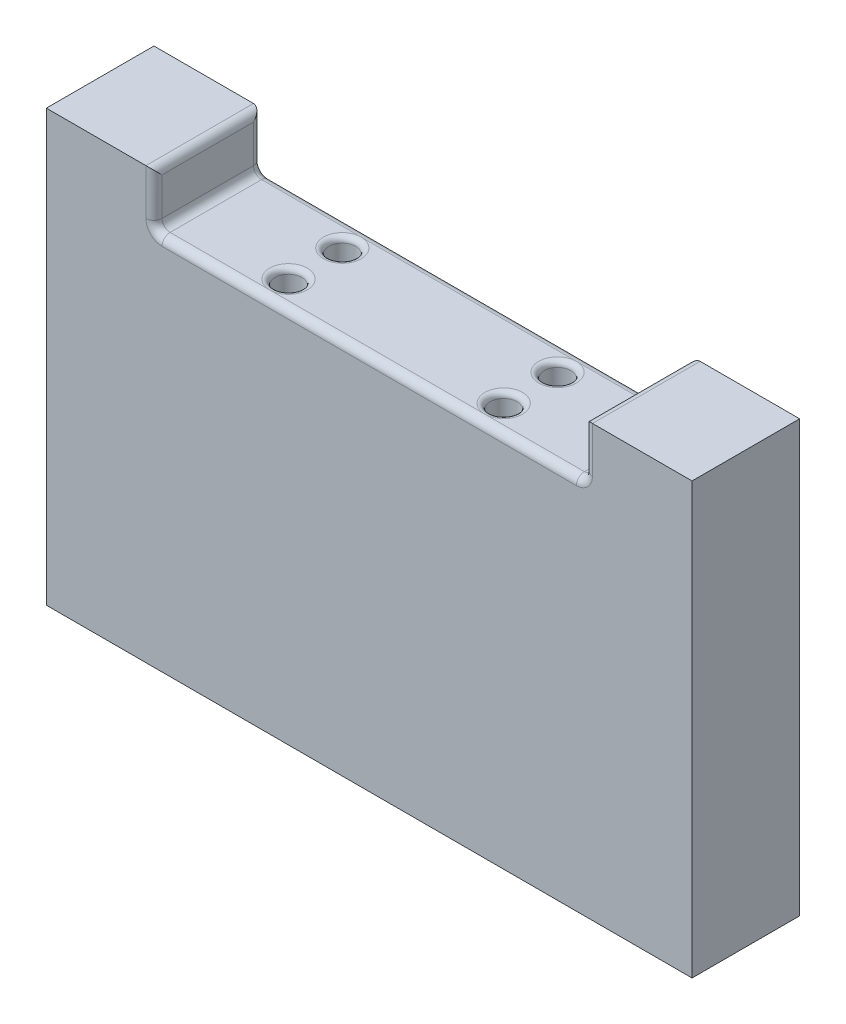
ISO-10303-21;
HEADER;
FILE_DESCRIPTION(('STEP AP214'),'2;1');
FILE_NAME('part.step','',(''),(''),'','','');
FILE_SCHEMA(('AUTOMOTIVE_DESIGN { 1 0 10303 214 1 1 1 1 }'));
ENDSEC;
DATA;
#1=APPLICATION_CONTEXT('core data for automotive mechanical design processes');
#2=APPLICATION_PROTOCOL_DEFINITION('international standard','automotive_design',2000,#1);
#3=PRODUCT_CONTEXT('',#1,'mechanical');
#4=PRODUCT('Part','Part','',(#3));
#5=PRODUCT_RELATED_PRODUCT_CATEGORY('part','',(#4));
#6=PRODUCT_DEFINITION_FORMATION('','',#4);
#7=PRODUCT_DEFINITION_CONTEXT('part definition',#1,'design');
#8=PRODUCT_DEFINITION('design','',#6,#7);
#9=PRODUCT_DEFINITION_SHAPE('','',#8);
#10=(LENGTH_UNIT() NAMED_UNIT(*) SI_UNIT(.MILLI.,.METRE.));
#11=(NAMED_UNIT(*) PLANE_ANGLE_UNIT() SI_UNIT($,.RADIAN.));
#12=(NAMED_UNIT(*) SI_UNIT($,.STERADIAN.) SOLID_ANGLE_UNIT());
#13=UNCERTAINTY_MEASURE_WITH_UNIT(LENGTH_MEASURE(1.E-05),#10,'distance_accuracy_value','');
#14=(GEOMETRIC_REPRESENTATION_CONTEXT(3) GLOBAL_UNCERTAINTY_ASSIGNED_CONTEXT((#13)) GLOBAL_UNIT_ASSIGNED_CONTEXT((#10,
#11,#12)) REPRESENTATION_CONTEXT('',''));
#15=CARTESIAN_POINT('',(0.,0.,0.));
#16=DIRECTION('',(0.,0.,1.));
#17=DIRECTION('',(1.,0.,0.));
#18=AXIS2_PLACEMENT_3D('',#15,#16,#17);
#19=CARTESIAN_POINT('',(-60.,40.,20.));
#20=DIRECTION('',(0.,-1.,0.));
#21=DIRECTION('',(0.,0.,-1.));
#22=AXIS2_PLACEMENT_3D('',#19,#20,#21);
#23=PLANE('',#22);
#24=DIRECTION('',(-1.,0.,0.));
#25=VECTOR('',#24,1.);
#26=CARTESIAN_POINT('',(-60.,40.,0.));
#27=LINE('',#26,#25);
#28=CARTESIAN_POINT('',(60.,40.,0.));
#29=VERTEX_POINT('',#28);
#30=CARTESIAN_POINT('',(41.5,40.,0.));
#31=VERTEX_POINT('',#30);
#32=EDGE_CURVE('E259',#29,#31,#27,.T.);
#33=ORIENTED_EDGE('',*,*,#32,.T.);
#34=DIRECTION('',(0.,0.,-1.));
#35=VECTOR('',#34,1.);
#36=CARTESIAN_POINT('',(41.5,40.,20.));
#37=LINE('',#36,#35);
#38=CARTESIAN_POINT('',(41.5,40.,20.));
#39=VERTEX_POINT('',#38);
#40=EDGE_CURVE('E188',#31,#39,#37,.F.);
#41=ORIENTED_EDGE('',*,*,#40,.T.);
#42=DIRECTION('',(-1.,0.,0.));
#43=VECTOR('',#42,1.);
#44=CARTESIAN_POINT('',(-60.,40.,20.));
#45=LINE('',#44,#43);
#46=CARTESIAN_POINT('',(60.,40.,20.));
#47=VERTEX_POINT('',#46);
#48=EDGE_CURVE('E181',#47,#39,#45,.T.);
#49=ORIENTED_EDGE('',*,*,#48,.F.);
#50=DIRECTION('',(0.,0.,-1.));
#51=VECTOR('',#50,1.);
#52=CARTESIAN_POINT('',(60.,40.,20.));
#53=LINE('',#52,#51);
#54=EDGE_CURVE('E185',#47,#29,#53,.T.);
#55=ORIENTED_EDGE('',*,*,#54,.T.);
#56=EDGE_LOOP('',(#33,#41,#49,#55));
#57=FACE_BOUND('',#56,.T.);
#58=ADVANCED_FACE('F54',(#57),#23,.F.);
#59=CARTESIAN_POINT('',(60.,-40.,20.));
#60=DIRECTION('',(-1.,0.,0.));
#61=DIRECTION('',(0.,0.,1.));
#62=AXIS2_PLACEMENT_3D('',#59,#60,#61);
#63=PLANE('',#62);
#64=DIRECTION('',(0.,1.,0.));
#65=VECTOR('',#64,1.);
#66=CARTESIAN_POINT('',(60.,-40.,0.));
#67=LINE('',#66,#65);
#68=CARTESIAN_POINT('',(60.,-40.,0.));
#69=VERTEX_POINT('',#68);
#70=EDGE_CURVE('E209',#69,#29,#67,.T.);
#71=ORIENTED_EDGE('',*,*,#70,.T.);
#72=ORIENTED_EDGE('',*,*,#54,.F.);
#73=DIRECTION('',(0.,1.,0.));
#74=VECTOR('',#73,1.);
#75=CARTESIAN_POINT('',(60.,-40.,20.));
#76=LINE('',#75,#74);
#77=CARTESIAN_POINT('',(60.,-40.,20.));
#78=VERTEX_POINT('',#77);
#79=EDGE_CURVE('E196',#78,#47,#76,.T.);
#80=ORIENTED_EDGE('',*,*,#79,.F.);
#81=DIRECTION('',(0.,0.,-1.));
#82=VECTOR('',#81,1.);
#83=CARTESIAN_POINT('',(60.,-40.,20.));
#84=LINE('',#83,#82);
#85=EDGE_CURVE('E238',#78,#69,#84,.T.);
#86=ORIENTED_EDGE('',*,*,#85,.T.);
#87=EDGE_LOOP('',(#71,#72,#80,#86));
#88=FACE_BOUND('',#87,.T.);
#89=ADVANCED_FACE('F207',(#88),#63,.F.);
#90=CARTESIAN_POINT('',(-41.5,40.,20.));
#91=VERTEX_POINT('',#90);
#92=CARTESIAN_POINT('',(-60.,40.,20.));
#93=VERTEX_POINT('',#92);
#94=EDGE_CURVE('E193',#91,#93,#45,.T.);
#95=ORIENTED_EDGE('',*,*,#94,.F.);
#96=DIRECTION('',(0.,0.,1.));
#97=VECTOR('',#96,1.);
#98=CARTESIAN_POINT('',(-41.5,40.,20.));
#99=LINE('',#98,#97);
#100=CARTESIAN_POINT('',(-41.5,40.,0.));
#101=VERTEX_POINT('',#100);
#102=EDGE_CURVE('E12',#91,#101,#99,.F.);
#103=ORIENTED_EDGE('',*,*,#102,.T.);
#104=CARTESIAN_POINT('',(-60.,40.,0.));
#105=VERTEX_POINT('',#104);
#106=EDGE_CURVE('E261',#101,#105,#27,.T.);
#107=ORIENTED_EDGE('',*,*,#106,.T.);
#108=DIRECTION('',(0.,0.,-1.));
#109=VECTOR('',#108,1.);
#110=CARTESIAN_POINT('',(-60.,40.,20.));
#111=LINE('',#110,#109);
#112=EDGE_CURVE('E212',#93,#105,#111,.T.);
#113=ORIENTED_EDGE('',*,*,#112,.F.);
#114=EDGE_LOOP('',(#95,#103,#107,#113));
#115=FACE_BOUND('',#114,.T.);
#116=ADVANCED_FACE('F303',(#115),#23,.F.);
#117=CARTESIAN_POINT('',(-60.,-40.,20.));
#118=DIRECTION('',(1.,0.,0.));
#119=DIRECTION('',(0.,0.,-1.));
#120=AXIS2_PLACEMENT_3D('',#117,#118,#119);
#121=PLANE('',#120);
#122=DIRECTION('',(0.,-1.,0.));
#123=VECTOR('',#122,1.);
#124=CARTESIAN_POINT('',(-60.,-40.,0.));
#125=LINE('',#124,#123);
#126=CARTESIAN_POINT('',(-60.,-40.,0.));
#127=VERTEX_POINT('',#126);
#128=EDGE_CURVE('E256',#105,#127,#125,.T.);
#129=ORIENTED_EDGE('',*,*,#128,.T.);
#130=DIRECTION('',(0.,0.,-1.));
#131=VECTOR('',#130,1.);
#132=CARTESIAN_POINT('',(-60.,-40.,20.));
#133=LINE('',#132,#131);
#134=CARTESIAN_POINT('',(-60.,-40.,20.));
#135=VERTEX_POINT('',#134);
#136=EDGE_CURVE('E220',#135,#127,#133,.T.);
#137=ORIENTED_EDGE('',*,*,#136,.F.);
#138=DIRECTION('',(0.,-1.,0.));
#139=VECTOR('',#138,1.);
#140=CARTESIAN_POINT('',(-60.,-40.,20.));
#141=LINE('',#140,#139);
#142=EDGE_CURVE('E192',#93,#135,#141,.T.);
#143=ORIENTED_EDGE('',*,*,#142,.F.);
#144=ORIENTED_EDGE('',*,*,#112,.T.);
#145=EDGE_LOOP('',(#129,#137,#143,#144));
#146=FACE_BOUND('',#145,.T.);
#147=ADVANCED_FACE('F300',(#146),#121,.F.);
#148=CARTESIAN_POINT('',(-60.,-40.,20.));
#149=DIRECTION('',(0.,1.,0.));
#150=DIRECTION('',(0.,0.,1.));
#151=AXIS2_PLACEMENT_3D('',#148,#149,#150);
#152=PLANE('',#151);
#153=CARTESIAN_POINT('',(20.,-40.,15.));
#154=DIRECTION('',(0.,1.,0.));
#155=DIRECTION('',(0.,0.,1.));
#156=AXIS2_PLACEMENT_3D('',#153,#154,#155);
#157=CIRCLE('',#156,3.5);
#158=CARTESIAN_POINT('',(20.,-40.,18.5));
#159=VERTEX_POINT('',#158);
#160=EDGE_CURVE('E789',#159,#159,#157,.T.);
#161=ORIENTED_EDGE('',*,*,#160,.T.);
#162=EDGE_LOOP('',(#161));
#163=FACE_BOUND('',#162,.T.);
#164=CARTESIAN_POINT('',(20.,-40.,5.));
#165=DIRECTION('',(0.,1.,0.));
#166=DIRECTION('',(0.,0.,1.));
#167=AXIS2_PLACEMENT_3D('',#164,#165,#166);
#168=CIRCLE('',#167,3.5);
#169=CARTESIAN_POINT('',(20.,-40.,8.5));
#170=VERTEX_POINT('',#169);
#171=EDGE_CURVE('E792',#170,#170,#168,.T.);
#172=ORIENTED_EDGE('',*,*,#171,.T.);
#173=EDGE_LOOP('',(#172));
#174=FACE_BOUND('',#173,.T.);
#175=CARTESIAN_POINT('',(-20.,-40.,15.));
#176=DIRECTION('',(0.,1.,0.));
#177=DIRECTION('',(0.,0.,1.));
#178=AXIS2_PLACEMENT_3D('',#175,#176,#177);
#179=CIRCLE('',#178,3.5);
#180=CARTESIAN_POINT('',(-20.,-40.,18.5));
#181=VERTEX_POINT('',#180);
#182=EDGE_CURVE('E688',#181,#181,#179,.T.);
#183=ORIENTED_EDGE('',*,*,#182,.T.);
#184=EDGE_LOOP('',(#183));
#185=FACE_BOUND('',#184,.T.);
#186=CARTESIAN_POINT('',(-20.,-40.,5.));
#187=DIRECTION('',(0.,1.,0.));
#188=DIRECTION('',(0.,0.,1.));
#189=AXIS2_PLACEMENT_3D('',#186,#187,#188);
#190=CIRCLE('',#189,3.5);
#191=CARTESIAN_POINT('',(-20.,-40.,8.5));
#192=VERTEX_POINT('',#191);
#193=EDGE_CURVE('E682',#192,#192,#190,.T.);
#194=ORIENTED_EDGE('',*,*,#193,.T.);
#195=EDGE_LOOP('',(#194));
#196=FACE_BOUND('',#195,.T.);
#197=DIRECTION('',(1.,0.,0.));
#198=VECTOR('',#197,1.);
#199=CARTESIAN_POINT('',(-60.,-40.,0.));
#200=LINE('',#199,#198);
#201=EDGE_CURVE('E205',#127,#69,#200,.T.);
#202=ORIENTED_EDGE('',*,*,#201,.T.);
#203=ORIENTED_EDGE('',*,*,#85,.F.);
#204=DIRECTION('',(1.,0.,0.));
#205=VECTOR('',#204,1.);
#206=CARTESIAN_POINT('',(-60.,-40.,20.));
#207=LINE('',#206,#205);
#208=EDGE_CURVE('E200',#135,#78,#207,.T.);
#209=ORIENTED_EDGE('',*,*,#208,.F.);
#210=ORIENTED_EDGE('',*,*,#136,.T.);
#211=EDGE_LOOP('',(#202,#203,#209,#210));
#212=FACE_BOUND('',#211,.T.);
#213=ADVANCED_FACE('F249',(#163,#174,#185,#196,#212),#152,.F.);
#214=CARTESIAN_POINT('',(0.,0.,20.));
#215=DIRECTION('',(0.,0.,-1.));
#216=DIRECTION('',(-1.,0.,0.));
#217=AXIS2_PLACEMENT_3D('',#214,#215,#216);
#218=PLANE('',#217);
#219=ORIENTED_EDGE('',*,*,#48,.T.);
#220=DIRECTION('',(0.,1.,0.));
#221=VECTOR('',#220,1.);
#222=CARTESIAN_POINT('',(41.5,0.,20.));
#223=LINE('',#222,#221);
#224=CARTESIAN_POINT('',(41.5,31.5,20.));
#225=VERTEX_POINT('',#224);
#226=EDGE_CURVE('E576',#39,#225,#223,.F.);
#227=ORIENTED_EDGE('',*,*,#226,.T.);
#228=CARTESIAN_POINT('',(38.5,31.5,20.));
#229=DIRECTION('',(0.,0.,-1.));
#230=DIRECTION('',(-1.,0.,0.));
#231=AXIS2_PLACEMENT_3D('',#228,#229,#230);
#232=CIRCLE('',#231,3.);
#233=CARTESIAN_POINT('',(38.5,28.5,20.));
#234=VERTEX_POINT('',#233);
#235=EDGE_CURVE('E625',#234,#225,#232,.F.);
#236=ORIENTED_EDGE('',*,*,#235,.F.);
#237=DIRECTION('',(1.,0.,0.));
#238=VECTOR('',#237,1.);
#239=CARTESIAN_POINT('',(-40.,28.5,20.));
#240=LINE('',#239,#238);
#241=CARTESIAN_POINT('',(-38.5,28.5,20.));
#242=VERTEX_POINT('',#241);
#243=EDGE_CURVE('E628',#234,#242,#240,.F.);
#244=ORIENTED_EDGE('',*,*,#243,.T.);
#245=CARTESIAN_POINT('',(-38.5,31.5,20.));
#246=DIRECTION('',(0.,0.,-1.));
#247=DIRECTION('',(-1.,0.,0.));
#248=AXIS2_PLACEMENT_3D('',#245,#246,#247);
#249=CIRCLE('',#248,3.);
#250=CARTESIAN_POINT('',(-41.5,31.5,20.));
#251=VERTEX_POINT('',#250);
#252=EDGE_CURVE('E632',#251,#242,#249,.F.);
#253=ORIENTED_EDGE('',*,*,#252,.F.);
#254=DIRECTION('',(0.,1.,0.));
#255=VECTOR('',#254,1.);
#256=CARTESIAN_POINT('',(-41.5,0.,20.));
#257=LINE('',#256,#255);
#258=EDGE_CURVE('E434',#251,#91,#257,.T.);
#259=ORIENTED_EDGE('',*,*,#258,.T.);
#260=ORIENTED_EDGE('',*,*,#94,.T.);
#261=ORIENTED_EDGE('',*,*,#142,.T.);
#262=ORIENTED_EDGE('',*,*,#208,.T.);
#263=ORIENTED_EDGE('',*,*,#79,.T.);
#264=EDGE_LOOP('',(#219,#227,#236,#244,#253,#259,#260,#261,#262,#263));
#265=FACE_BOUND('',#264,.T.);
#266=ADVANCED_FACE('F198',(#265),#218,.F.);
#267=CARTESIAN_POINT('',(0.,0.,0.));
#268=DIRECTION('',(0.,0.,-1.));
#269=DIRECTION('',(-1.,0.,0.));
#270=AXIS2_PLACEMENT_3D('',#267,#268,#269);
#271=PLANE('',#270);
#272=CARTESIAN_POINT('',(38.5,31.5,0.));
#273=DIRECTION('',(0.,0.,-1.));
#274=DIRECTION('',(-1.,0.,0.));
#275=AXIS2_PLACEMENT_3D('',#272,#273,#274);
#276=CIRCLE('',#275,3.);
#277=CARTESIAN_POINT('',(41.5,31.5,0.));
#278=VERTEX_POINT('',#277);
#279=CARTESIAN_POINT('',(38.5,28.5,0.));
#280=VERTEX_POINT('',#279);
#281=EDGE_CURVE('E491',#278,#280,#276,.T.);
#282=ORIENTED_EDGE('',*,*,#281,.F.);
#283=DIRECTION('',(0.,-1.,0.));
#284=VECTOR('',#283,1.);
#285=CARTESIAN_POINT('',(41.5,40.,0.));
#286=LINE('',#285,#284);
#287=EDGE_CURVE('E412',#278,#31,#286,.F.);
#288=ORIENTED_EDGE('',*,*,#287,.T.);
#289=ORIENTED_EDGE('',*,*,#32,.F.);
#290=ORIENTED_EDGE('',*,*,#70,.F.);
#291=ORIENTED_EDGE('',*,*,#201,.F.);
#292=ORIENTED_EDGE('',*,*,#128,.F.);
#293=ORIENTED_EDGE('',*,*,#106,.F.);
#294=DIRECTION('',(0.,1.,0.));
#295=VECTOR('',#294,1.);
#296=CARTESIAN_POINT('',(-41.5,30.,0.));
#297=LINE('',#296,#295);
#298=CARTESIAN_POINT('',(-41.5,31.5,0.));
#299=VERTEX_POINT('',#298);
#300=EDGE_CURVE('E471',#101,#299,#297,.F.);
#301=ORIENTED_EDGE('',*,*,#300,.T.);
#302=CARTESIAN_POINT('',(-38.5,31.5,0.));
#303=DIRECTION('',(0.,0.,-1.));
#304=DIRECTION('',(-1.,0.,0.));
#305=AXIS2_PLACEMENT_3D('',#302,#303,#304);
#306=CIRCLE('',#305,3.);
#307=CARTESIAN_POINT('',(-38.5,28.5,0.));
#308=VERTEX_POINT('',#307);
#309=EDGE_CURVE('E466',#308,#299,#306,.T.);
#310=ORIENTED_EDGE('',*,*,#309,.F.);
#311=DIRECTION('',(1.,0.,0.));
#312=VECTOR('',#311,1.);
#313=CARTESIAN_POINT('',(0.,28.5,0.));
#314=LINE('',#313,#312);
#315=EDGE_CURVE('E487',#308,#280,#314,.T.);
#316=ORIENTED_EDGE('',*,*,#315,.T.);
#317=EDGE_LOOP('',(#282,#288,#289,#290,#291,#292,#293,#301,#310,#316));
#318=FACE_BOUND('',#317,.T.);
#319=ADVANCED_FACE('F254',(#318),#271,.T.);
#320=CARTESIAN_POINT('',(40.,30.,-20.));
#321=DIRECTION('',(1.,0.,0.));
#322=DIRECTION('',(0.,0.,-1.));
#323=AXIS2_PLACEMENT_3D('',#320,#321,#322);
#324=PLANE('',#323);
#325=DIRECTION('',(0.,1.,0.));
#326=VECTOR('',#325,1.);
#327=CARTESIAN_POINT('',(40.,30.,18.5));
#328=LINE('',#327,#326);
#329=CARTESIAN_POINT('',(40.,31.5,18.5));
#330=VERTEX_POINT('',#329);
#331=CARTESIAN_POINT('',(40.,38.5,18.5));
#332=VERTEX_POINT('',#331);
#333=EDGE_CURVE('E529',#330,#332,#328,.T.);
#334=ORIENTED_EDGE('',*,*,#333,.T.);
#335=DIRECTION('',(0.,0.,-1.));
#336=VECTOR('',#335,1.);
#337=CARTESIAN_POINT('',(40.,38.5,-20.));
#338=LINE('',#337,#336);
#339=CARTESIAN_POINT('',(40.,38.5,1.5));
#340=VERTEX_POINT('',#339);
#341=EDGE_CURVE('E524',#332,#340,#338,.T.);
#342=ORIENTED_EDGE('',*,*,#341,.T.);
#343=DIRECTION('',(0.,-1.,0.));
#344=VECTOR('',#343,1.);
#345=CARTESIAN_POINT('',(40.,30.,1.5));
#346=LINE('',#345,#344);
#347=CARTESIAN_POINT('',(40.,31.5,1.5));
#348=VERTEX_POINT('',#347);
#349=EDGE_CURVE('E571',#340,#348,#346,.T.);
#350=ORIENTED_EDGE('',*,*,#349,.T.);
#351=DIRECTION('',(0.,0.,-1.));
#352=VECTOR('',#351,1.);
#353=CARTESIAN_POINT('',(40.,31.5,-20.));
#354=LINE('',#353,#352);
#355=EDGE_CURVE('E575',#348,#330,#354,.F.);
#356=ORIENTED_EDGE('',*,*,#355,.T.);
#357=EDGE_LOOP('',(#334,#342,#350,#356));
#358=FACE_BOUND('',#357,.T.);
#359=ADVANCED_FACE('F604',(#358),#324,.F.);
#360=CARTESIAN_POINT('',(-40.,30.,-20.));
#361=DIRECTION('',(-1.,0.,0.));
#362=DIRECTION('',(0.,0.,1.));
#363=AXIS2_PLACEMENT_3D('',#360,#361,#362);
#364=PLANE('',#363);
#365=DIRECTION('',(0.,1.,0.));
#366=VECTOR('',#365,1.);
#367=CARTESIAN_POINT('',(-40.,30.,18.5));
#368=LINE('',#367,#366);
#369=CARTESIAN_POINT('',(-40.,38.5,18.5));
#370=VERTEX_POINT('',#369);
#371=CARTESIAN_POINT('',(-40.,31.5,18.5));
#372=VERTEX_POINT('',#371);
#373=EDGE_CURVE('E73',#370,#372,#368,.F.);
#374=ORIENTED_EDGE('',*,*,#373,.T.);
#375=DIRECTION('',(0.,0.,1.));
#376=VECTOR('',#375,1.);
#377=CARTESIAN_POINT('',(-40.,31.5,-20.));
#378=LINE('',#377,#376);
#379=CARTESIAN_POINT('',(-40.,31.5,1.5));
#380=VERTEX_POINT('',#379);
#381=EDGE_CURVE('E65',#372,#380,#378,.F.);
#382=ORIENTED_EDGE('',*,*,#381,.T.);
#383=DIRECTION('',(0.,1.,0.));
#384=VECTOR('',#383,1.);
#385=CARTESIAN_POINT('',(-40.,40.,1.5));
#386=LINE('',#385,#384);
#387=CARTESIAN_POINT('',(-40.,38.5,1.5));
#388=VERTEX_POINT('',#387);
#389=EDGE_CURVE('E509',#380,#388,#386,.T.);
#390=ORIENTED_EDGE('',*,*,#389,.T.);
#391=DIRECTION('',(0.,0.,1.));
#392=VECTOR('',#391,1.);
#393=CARTESIAN_POINT('',(-40.,38.5,-20.));
#394=LINE('',#393,#392);
#395=EDGE_CURVE('E78',#388,#370,#394,.T.);
#396=ORIENTED_EDGE('',*,*,#395,.T.);
#397=EDGE_LOOP('',(#374,#382,#390,#396));
#398=FACE_BOUND('',#397,.T.);
#399=ADVANCED_FACE('F756',(#398),#364,.F.);
#400=CARTESIAN_POINT('',(0.,30.,0.));
#401=DIRECTION('',(0.,1.,0.));
#402=DIRECTION('',(0.,0.,1.));
#403=AXIS2_PLACEMENT_3D('',#400,#401,#402);
#404=PLANE('',#403);
#405=CARTESIAN_POINT('',(-20.,30.,15.));
#406=DIRECTION('',(0.,1.,0.));
#407=DIRECTION('',(0.,0.,1.));
#408=AXIS2_PLACEMENT_3D('',#405,#406,#407);
#409=CIRCLE('',#408,3.5);
#410=CARTESIAN_POINT('',(-20.,30.,18.5));
#411=VERTEX_POINT('',#410);
#412=EDGE_CURVE('E672',#411,#411,#409,.F.);
#413=ORIENTED_EDGE('',*,*,#412,.T.);
#414=DIRECTION('',(1.,0.,0.));
#415=VECTOR('',#414,1.);
#416=CARTESIAN_POINT('',(40.,30.,18.5));
#417=LINE('',#416,#415);
#418=CARTESIAN_POINT('',(20.,30.,18.5));
#419=VERTEX_POINT('',#418);
#420=EDGE_CURVE('E429',#411,#419,#417,.T.);
#421=ORIENTED_EDGE('',*,*,#420,.T.);
#422=CARTESIAN_POINT('',(20.,30.,15.));
#423=DIRECTION('',(0.,1.,0.));
#424=DIRECTION('',(0.,0.,1.));
#425=AXIS2_PLACEMENT_3D('',#422,#423,#424);
#426=CIRCLE('',#425,3.5);
#427=EDGE_CURVE('E679',#419,#419,#426,.F.);
#428=ORIENTED_EDGE('',*,*,#427,.T.);
#429=DIRECTION('',(1.,0.,0.));
#430=VECTOR('',#429,1.);
#431=CARTESIAN_POINT('',(40.,30.,18.5));
#432=LINE('',#431,#430);
#433=CARTESIAN_POINT('',(38.5,30.,18.5));
#434=VERTEX_POINT('',#433);
#435=EDGE_CURVE('E435',#419,#434,#432,.T.);
#436=ORIENTED_EDGE('',*,*,#435,.T.);
#437=DIRECTION('',(0.,0.,-1.));
#438=VECTOR('',#437,1.);
#439=CARTESIAN_POINT('',(38.5,30.,0.));
#440=LINE('',#439,#438);
#441=CARTESIAN_POINT('',(38.5,30.,1.5));
#442=VERTEX_POINT('',#441);
#443=EDGE_CURVE('E448',#434,#442,#440,.T.);
#444=ORIENTED_EDGE('',*,*,#443,.T.);
#445=DIRECTION('',(1.,0.,0.));
#446=VECTOR('',#445,1.);
#447=CARTESIAN_POINT('',(0.,30.,1.5));
#448=LINE('',#447,#446);
#449=CARTESIAN_POINT('',(20.,30.,1.5));
#450=VERTEX_POINT('',#449);
#451=EDGE_CURVE('E452',#442,#450,#448,.F.);
#452=ORIENTED_EDGE('',*,*,#451,.T.);
#453=CARTESIAN_POINT('',(20.,30.,5.));
#454=DIRECTION('',(0.,1.,0.));
#455=DIRECTION('',(0.,0.,1.));
#456=AXIS2_PLACEMENT_3D('',#453,#454,#455);
#457=CIRCLE('',#456,3.5);
#458=EDGE_CURVE('E683',#450,#450,#457,.F.);
#459=ORIENTED_EDGE('',*,*,#458,.T.);
#460=DIRECTION('',(1.,0.,0.));
#461=VECTOR('',#460,1.);
#462=CARTESIAN_POINT('',(0.,30.,1.5));
#463=LINE('',#462,#461);
#464=CARTESIAN_POINT('',(-20.,30.,1.5));
#465=VERTEX_POINT('',#464);
#466=EDGE_CURVE('E656',#450,#465,#463,.F.);
#467=ORIENTED_EDGE('',*,*,#466,.T.);
#468=CARTESIAN_POINT('',(-20.,30.,5.));
#469=DIRECTION('',(0.,1.,0.));
#470=DIRECTION('',(0.,0.,1.));
#471=AXIS2_PLACEMENT_3D('',#468,#469,#470);
#472=CIRCLE('',#471,3.5);
#473=EDGE_CURVE('E808',#465,#465,#472,.F.);
#474=ORIENTED_EDGE('',*,*,#473,.T.);
#475=DIRECTION('',(1.,0.,0.));
#476=VECTOR('',#475,1.);
#477=CARTESIAN_POINT('',(0.,30.,1.5));
#478=LINE('',#477,#476);
#479=CARTESIAN_POINT('',(-38.5,30.,1.5));
#480=VERTEX_POINT('',#479);
#481=EDGE_CURVE('E660',#465,#480,#478,.F.);
#482=ORIENTED_EDGE('',*,*,#481,.T.);
#483=DIRECTION('',(0.,0.,1.));
#484=VECTOR('',#483,1.);
#485=CARTESIAN_POINT('',(-38.5,30.,0.));
#486=LINE('',#485,#484);
#487=CARTESIAN_POINT('',(-38.5,30.,18.5));
#488=VERTEX_POINT('',#487);
#489=EDGE_CURVE('E406',#480,#488,#486,.T.);
#490=ORIENTED_EDGE('',*,*,#489,.T.);
#491=DIRECTION('',(1.,0.,0.));
#492=VECTOR('',#491,1.);
#493=CARTESIAN_POINT('',(40.,30.,18.5));
#494=LINE('',#493,#492);
#495=EDGE_CURVE('E411',#488,#411,#494,.T.);
#496=ORIENTED_EDGE('',*,*,#495,.T.);
#497=EDGE_LOOP('',(#413,#421,#428,#436,#444,#452,#459,#467,#474,#482,#490,#496));
#498=FACE_BOUND('',#497,.T.);
#499=ADVANCED_FACE('F670',(#498),#404,.T.);
#500=CARTESIAN_POINT('',(-20.,-40.,5.));
#501=DIRECTION('',(0.,1.,0.));
#502=DIRECTION('',(0.,0.,1.));
#503=AXIS2_PLACEMENT_3D('',#500,#501,#502);
#504=CYLINDRICAL_SURFACE('',#503,2.5);
#505=CARTESIAN_POINT('',(-20.,29.,5.));
#506=DIRECTION('',(0.,1.,0.));
#507=DIRECTION('',(0.,0.,1.));
#508=AXIS2_PLACEMENT_3D('',#505,#506,#507);
#509=CIRCLE('',#508,2.5);
#510=CARTESIAN_POINT('',(-20.,29.,7.5));
#511=VERTEX_POINT('',#510);
#512=EDGE_CURVE('E472',#511,#511,#509,.T.);
#513=ORIENTED_EDGE('',*,*,#512,.T.);
#514=EDGE_LOOP('',(#513));
#515=FACE_BOUND('',#514,.T.);
#516=CARTESIAN_POINT('',(-20.,-39.,5.));
#517=DIRECTION('',(0.,1.,0.));
#518=DIRECTION('',(0.,0.,1.));
#519=AXIS2_PLACEMENT_3D('',#516,#517,#518);
#520=CIRCLE('',#519,2.5);
#521=CARTESIAN_POINT('',(-20.,-39.,7.5));
#522=VERTEX_POINT('',#521);
#523=EDGE_CURVE('E705',#522,#522,#520,.F.);
#524=ORIENTED_EDGE('',*,*,#523,.T.);
#525=EDGE_LOOP('',(#524));
#526=FACE_BOUND('',#525,.T.);
#527=ADVANCED_FACE('F715',(#515,#526),#504,.F.);
#528=CARTESIAN_POINT('',(20.,-40.,15.));
#529=DIRECTION('',(0.,1.,0.));
#530=DIRECTION('',(0.,0.,1.));
#531=AXIS2_PLACEMENT_3D('',#528,#529,#530);
#532=CYLINDRICAL_SURFACE('',#531,2.5);
#533=CARTESIAN_POINT('',(20.,29.,15.));
#534=DIRECTION('',(0.,1.,0.));
#535=DIRECTION('',(0.,0.,1.));
#536=AXIS2_PLACEMENT_3D('',#533,#534,#535);
#537=CIRCLE('',#536,2.5);
#538=CARTESIAN_POINT('',(20.,29.,17.5));
#539=VERTEX_POINT('',#538);
#540=EDGE_CURVE('E217',#539,#539,#537,.T.);
#541=ORIENTED_EDGE('',*,*,#540,.T.);
#542=EDGE_LOOP('',(#541));
#543=FACE_BOUND('',#542,.T.);
#544=CARTESIAN_POINT('',(20.,-39.,15.));
#545=DIRECTION('',(0.,1.,0.));
#546=DIRECTION('',(0.,0.,1.));
#547=AXIS2_PLACEMENT_3D('',#544,#545,#546);
#548=CIRCLE('',#547,2.5);
#549=CARTESIAN_POINT('',(20.,-39.,17.5));
#550=VERTEX_POINT('',#549);
#551=EDGE_CURVE('E211',#550,#550,#548,.F.);
#552=ORIENTED_EDGE('',*,*,#551,.T.);
#553=EDGE_LOOP('',(#552));
#554=FACE_BOUND('',#553,.T.);
#555=ADVANCED_FACE('F763',(#543,#554),#532,.F.);
#556=CARTESIAN_POINT('',(20.,-40.,5.));
#557=DIRECTION('',(0.,1.,0.));
#558=DIRECTION('',(0.,0.,1.));
#559=AXIS2_PLACEMENT_3D('',#556,#557,#558);
#560=CYLINDRICAL_SURFACE('',#559,2.5);
#561=CARTESIAN_POINT('',(20.,29.,5.));
#562=DIRECTION('',(0.,1.,0.));
#563=DIRECTION('',(0.,0.,1.));
#564=AXIS2_PLACEMENT_3D('',#561,#562,#563);
#565=CIRCLE('',#564,2.5);
#566=CARTESIAN_POINT('',(20.,29.,7.5));
#567=VERTEX_POINT('',#566);
#568=EDGE_CURVE('E796',#567,#567,#565,.T.);
#569=ORIENTED_EDGE('',*,*,#568,.T.);
#570=EDGE_LOOP('',(#569));
#571=FACE_BOUND('',#570,.T.);
#572=CARTESIAN_POINT('',(20.,-39.,5.));
#573=DIRECTION('',(0.,1.,0.));
#574=DIRECTION('',(0.,0.,1.));
#575=AXIS2_PLACEMENT_3D('',#572,#573,#574);
#576=CIRCLE('',#575,2.5);
#577=CARTESIAN_POINT('',(20.,-39.,7.5));
#578=VERTEX_POINT('',#577);
#579=EDGE_CURVE('E791',#578,#578,#576,.F.);
#580=ORIENTED_EDGE('',*,*,#579,.T.);
#581=EDGE_LOOP('',(#580));
#582=FACE_BOUND('',#581,.T.);
#583=ADVANCED_FACE('F764',(#571,#582),#560,.F.);
#584=CARTESIAN_POINT('',(-20.,-40.,15.));
#585=DIRECTION('',(0.,1.,0.));
#586=DIRECTION('',(0.,0.,1.));
#587=AXIS2_PLACEMENT_3D('',#584,#585,#586);
#588=CYLINDRICAL_SURFACE('',#587,2.5);
#589=CARTESIAN_POINT('',(-20.,29.,15.));
#590=DIRECTION('',(0.,1.,0.));
#591=DIRECTION('',(0.,0.,1.));
#592=AXIS2_PLACEMENT_3D('',#589,#590,#591);
#593=CIRCLE('',#592,2.5);
#594=CARTESIAN_POINT('',(-20.,29.,17.5));
#595=VERTEX_POINT('',#594);
#596=EDGE_CURVE('E700',#595,#595,#593,.T.);
#597=ORIENTED_EDGE('',*,*,#596,.T.);
#598=EDGE_LOOP('',(#597));
#599=FACE_BOUND('',#598,.T.);
#600=CARTESIAN_POINT('',(-20.,-39.,15.));
#601=DIRECTION('',(0.,1.,0.));
#602=DIRECTION('',(0.,0.,1.));
#603=AXIS2_PLACEMENT_3D('',#600,#601,#602);
#604=CIRCLE('',#603,2.5);
#605=CARTESIAN_POINT('',(-20.,-39.,17.5));
#606=VERTEX_POINT('',#605);
#607=EDGE_CURVE('E706',#606,#606,#604,.F.);
#608=ORIENTED_EDGE('',*,*,#607,.T.);
#609=EDGE_LOOP('',(#608));
#610=FACE_BOUND('',#609,.T.);
#611=ADVANCED_FACE('F767',(#599,#610),#588,.F.);
#612=CARTESIAN_POINT('',(20.,29.,15.));
#613=DIRECTION('',(0.,1.,0.));
#614=DIRECTION('',(0.,0.,1.));
#615=AXIS2_PLACEMENT_3D('',#612,#613,#614);
#616=TOROIDAL_SURFACE('',#615,3.5,1.);
#617=ORIENTED_EDGE('',*,*,#427,.F.);
#618=EDGE_LOOP('',(#617));
#619=FACE_BOUND('',#618,.T.);
#620=ORIENTED_EDGE('',*,*,#540,.F.);
#621=EDGE_LOOP('',(#620));
#622=FACE_BOUND('',#621,.T.);
#623=ADVANCED_FACE('F771',(#619,#622),#616,.T.);
#624=CARTESIAN_POINT('',(20.,-39.,15.));
#625=DIRECTION('',(0.,1.,0.));
#626=DIRECTION('',(0.,0.,1.));
#627=AXIS2_PLACEMENT_3D('',#624,#625,#626);
#628=TOROIDAL_SURFACE('',#627,3.5,1.);
#629=ORIENTED_EDGE('',*,*,#551,.F.);
#630=EDGE_LOOP('',(#629));
#631=FACE_BOUND('',#630,.T.);
#632=ORIENTED_EDGE('',*,*,#160,.F.);
#633=EDGE_LOOP('',(#632));
#634=FACE_BOUND('',#633,.T.);
#635=ADVANCED_FACE('F782',(#631,#634),#628,.T.);
#636=CARTESIAN_POINT('',(20.,29.,5.));
#637=DIRECTION('',(0.,1.,0.));
#638=DIRECTION('',(0.,0.,1.));
#639=AXIS2_PLACEMENT_3D('',#636,#637,#638);
#640=TOROIDAL_SURFACE('',#639,3.5,1.);
#641=ORIENTED_EDGE('',*,*,#458,.F.);
#642=EDGE_LOOP('',(#641));
#643=FACE_BOUND('',#642,.T.);
#644=ORIENTED_EDGE('',*,*,#568,.F.);
#645=EDGE_LOOP('',(#644));
#646=FACE_BOUND('',#645,.T.);
#647=ADVANCED_FACE('F785',(#643,#646),#640,.T.);
#648=CARTESIAN_POINT('',(20.,-39.,5.));
#649=DIRECTION('',(0.,1.,0.));
#650=DIRECTION('',(0.,0.,1.));
#651=AXIS2_PLACEMENT_3D('',#648,#649,#650);
#652=TOROIDAL_SURFACE('',#651,3.5,1.);
#653=ORIENTED_EDGE('',*,*,#579,.F.);
#654=EDGE_LOOP('',(#653));
#655=FACE_BOUND('',#654,.T.);
#656=ORIENTED_EDGE('',*,*,#171,.F.);
#657=EDGE_LOOP('',(#656));
#658=FACE_BOUND('',#657,.T.);
#659=ADVANCED_FACE('F860',(#655,#658),#652,.T.);
#660=CARTESIAN_POINT('',(-20.,29.,15.));
#661=DIRECTION('',(0.,1.,0.));
#662=DIRECTION('',(0.,0.,1.));
#663=AXIS2_PLACEMENT_3D('',#660,#661,#662);
#664=TOROIDAL_SURFACE('',#663,3.5,1.);
#665=ORIENTED_EDGE('',*,*,#412,.F.);
#666=EDGE_LOOP('',(#665));
#667=FACE_BOUND('',#666,.T.);
#668=ORIENTED_EDGE('',*,*,#596,.F.);
#669=EDGE_LOOP('',(#668));
#670=FACE_BOUND('',#669,.T.);
#671=ADVANCED_FACE('F729',(#667,#670),#664,.T.);
#672=CARTESIAN_POINT('',(-20.,-39.,15.));
#673=DIRECTION('',(0.,1.,0.));
#674=DIRECTION('',(0.,0.,1.));
#675=AXIS2_PLACEMENT_3D('',#672,#673,#674);
#676=TOROIDAL_SURFACE('',#675,3.5,1.);
#677=ORIENTED_EDGE('',*,*,#607,.F.);
#678=EDGE_LOOP('',(#677));
#679=FACE_BOUND('',#678,.T.);
#680=ORIENTED_EDGE('',*,*,#182,.F.);
#681=EDGE_LOOP('',(#680));
#682=FACE_BOUND('',#681,.T.);
#683=ADVANCED_FACE('F720',(#679,#682),#676,.T.);
#684=CARTESIAN_POINT('',(-20.,29.,5.));
#685=DIRECTION('',(0.,1.,0.));
#686=DIRECTION('',(0.,0.,1.));
#687=AXIS2_PLACEMENT_3D('',#684,#685,#686);
#688=TOROIDAL_SURFACE('',#687,3.5,1.);
#689=ORIENTED_EDGE('',*,*,#473,.F.);
#690=EDGE_LOOP('',(#689));
#691=FACE_BOUND('',#690,.T.);
#692=ORIENTED_EDGE('',*,*,#512,.F.);
#693=EDGE_LOOP('',(#692));
#694=FACE_BOUND('',#693,.T.);
#695=ADVANCED_FACE('F717',(#691,#694),#688,.T.);
#696=CARTESIAN_POINT('',(-20.,-39.,5.));
#697=DIRECTION('',(0.,1.,0.));
#698=DIRECTION('',(0.,0.,1.));
#699=AXIS2_PLACEMENT_3D('',#696,#697,#698);
#700=TOROIDAL_SURFACE('',#699,3.5,1.);
#701=ORIENTED_EDGE('',*,*,#523,.F.);
#702=EDGE_LOOP('',(#701));
#703=FACE_BOUND('',#702,.T.);
#704=ORIENTED_EDGE('',*,*,#193,.F.);
#705=EDGE_LOOP('',(#704));
#706=FACE_BOUND('',#705,.T.);
#707=ADVANCED_FACE('F719',(#703,#706),#700,.T.);
#708=CARTESIAN_POINT('',(-41.5,0.,18.5));
#709=DIRECTION('',(0.,1.,0.));
#710=DIRECTION('',(0.,0.,1.));
#711=AXIS2_PLACEMENT_3D('',#708,#709,#710);
#712=CYLINDRICAL_SURFACE('',#711,1.5);
#713=CARTESIAN_POINT('',(-41.5,38.5,18.5));
#714=DIRECTION('',(0.,-0.707106781186547,0.707106781186547));
#715=DIRECTION('',(0.,0.707106781186547,0.707106781186547));
#716=AXIS2_PLACEMENT_3D('',#713,#714,#715);
#717=ELLIPSE('',#716,2.12132034355964,1.5);
#718=EDGE_CURVE('E314',#91,#370,#717,.F.);
#719=ORIENTED_EDGE('',*,*,#718,.F.);
#720=ORIENTED_EDGE('',*,*,#258,.F.);
#721=CARTESIAN_POINT('',(-41.5,31.5,18.5));
#722=DIRECTION('',(0.,-1.,0.));
#723=DIRECTION('',(0.,0.,-1.));
#724=AXIS2_PLACEMENT_3D('',#721,#722,#723);
#725=CIRCLE('',#724,1.5);
#726=EDGE_CURVE('E311',#372,#251,#725,.T.);
#727=ORIENTED_EDGE('',*,*,#726,.F.);
#728=ORIENTED_EDGE('',*,*,#373,.F.);
#729=EDGE_LOOP('',(#719,#720,#727,#728));
#730=FACE_BOUND('',#729,.T.);
#731=ADVANCED_FACE('F56',(#730),#712,.T.);
#732=CARTESIAN_POINT('',(41.5,30.,18.5));
#733=DIRECTION('',(0.,1.,0.));
#734=DIRECTION('',(0.,0.,1.));
#735=AXIS2_PLACEMENT_3D('',#732,#733,#734);
#736=CYLINDRICAL_SURFACE('',#735,1.5);
#737=CARTESIAN_POINT('',(41.5,31.5,18.5));
#738=DIRECTION('',(0.,-1.,0.));
#739=DIRECTION('',(0.,0.,-1.));
#740=AXIS2_PLACEMENT_3D('',#737,#738,#739);
#741=CIRCLE('',#740,1.5);
#742=EDGE_CURVE('E321',#225,#330,#741,.T.);
#743=ORIENTED_EDGE('',*,*,#742,.F.);
#744=ORIENTED_EDGE('',*,*,#226,.F.);
#745=CARTESIAN_POINT('',(41.5,38.5,18.5));
#746=DIRECTION('',(0.,0.707106781186547,-0.707106781186547));
#747=DIRECTION('',(0.,0.707106781186547,0.707106781186547));
#748=AXIS2_PLACEMENT_3D('',#745,#746,#747);
#749=ELLIPSE('',#748,2.12132034355964,1.5);
#750=EDGE_CURVE('E317',#332,#39,#749,.T.);
#751=ORIENTED_EDGE('',*,*,#750,.F.);
#752=ORIENTED_EDGE('',*,*,#333,.F.);
#753=EDGE_LOOP('',(#743,#744,#751,#752));
#754=FACE_BOUND('',#753,.T.);
#755=ADVANCED_FACE('F608',(#754),#736,.T.);
#756=CARTESIAN_POINT('',(0.,28.5,18.5));
#757=DIRECTION('',(-1.,0.,0.));
#758=DIRECTION('',(0.,0.,1.));
#759=AXIS2_PLACEMENT_3D('',#756,#757,#758);
#760=CYLINDRICAL_SURFACE('',#759,1.5);
#761=CARTESIAN_POINT('',(-38.5,28.5,18.5));
#762=DIRECTION('',(-1.,0.,0.));
#763=DIRECTION('',(0.,0.,1.));
#764=AXIS2_PLACEMENT_3D('',#761,#762,#763);
#765=CIRCLE('',#764,1.5);
#766=EDGE_CURVE('E58',#242,#488,#765,.T.);
#767=ORIENTED_EDGE('',*,*,#766,.F.);
#768=ORIENTED_EDGE('',*,*,#243,.F.);
#769=CARTESIAN_POINT('',(38.5,28.5,18.5));
#770=DIRECTION('',(1.,0.,0.));
#771=DIRECTION('',(0.,0.,-1.));
#772=AXIS2_PLACEMENT_3D('',#769,#770,#771);
#773=CIRCLE('',#772,1.5);
#774=EDGE_CURVE('E325',#434,#234,#773,.T.);
#775=ORIENTED_EDGE('',*,*,#774,.F.);
#776=ORIENTED_EDGE('',*,*,#435,.F.);
#777=ORIENTED_EDGE('',*,*,#420,.F.);
#778=ORIENTED_EDGE('',*,*,#495,.F.);
#779=EDGE_LOOP('',(#767,#768,#775,#776,#777,#778));
#780=FACE_BOUND('',#779,.T.);
#781=ADVANCED_FACE('F675',(#780),#760,.T.);
#782=CARTESIAN_POINT('',(-38.5,31.5,18.5));
#783=DIRECTION('',(0.,0.,-1.));
#784=DIRECTION('',(-1.,0.,0.));
#785=AXIS2_PLACEMENT_3D('',#782,#783,#784);
#786=TOROIDAL_SURFACE('',#785,3.,1.5);
#787=ORIENTED_EDGE('',*,*,#252,.T.);
#788=ORIENTED_EDGE('',*,*,#766,.T.);
#789=CARTESIAN_POINT('',(-38.5,31.5,18.5));
#790=DIRECTION('',(0.,0.,-1.));
#791=DIRECTION('',(-1.,0.,0.));
#792=AXIS2_PLACEMENT_3D('',#789,#790,#791);
#793=CIRCLE('',#792,1.5);
#794=EDGE_CURVE('E329',#372,#488,#793,.F.);
#795=ORIENTED_EDGE('',*,*,#794,.F.);
#796=ORIENTED_EDGE('',*,*,#726,.T.);
#797=EDGE_LOOP('',(#787,#788,#795,#796));
#798=FACE_BOUND('',#797,.T.);
#799=ADVANCED_FACE('F641',(#798),#786,.T.);
#800=CARTESIAN_POINT('',(-41.5,38.5,-20.));
#801=DIRECTION('',(0.,0.,1.));
#802=DIRECTION('',(1.,0.,0.));
#803=AXIS2_PLACEMENT_3D('',#800,#801,#802);
#804=CYLINDRICAL_SURFACE('',#803,1.5);
#805=ORIENTED_EDGE('',*,*,#718,.T.);
#806=ORIENTED_EDGE('',*,*,#395,.F.);
#807=CARTESIAN_POINT('',(-41.5,38.5,1.5));
#808=DIRECTION('',(0.,-0.707106781186547,-0.707106781186547));
#809=DIRECTION('',(0.,-0.707106781186547,0.707106781186547));
#810=AXIS2_PLACEMENT_3D('',#807,#808,#809);
#811=ELLIPSE('',#810,2.12132034355964,1.5);
#812=EDGE_CURVE('E333',#101,#388,#811,.T.);
#813=ORIENTED_EDGE('',*,*,#812,.F.);
#814=ORIENTED_EDGE('',*,*,#102,.F.);
#815=EDGE_LOOP('',(#805,#806,#813,#814));
#816=FACE_BOUND('',#815,.T.);
#817=ADVANCED_FACE('F820',(#816),#804,.T.);
#818=CARTESIAN_POINT('',(41.5,38.5,-20.));
#819=DIRECTION('',(0.,0.,-1.));
#820=DIRECTION('',(-1.,0.,0.));
#821=AXIS2_PLACEMENT_3D('',#818,#819,#820);
#822=CYLINDRICAL_SURFACE('',#821,1.5);
#823=ORIENTED_EDGE('',*,*,#750,.T.);
#824=ORIENTED_EDGE('',*,*,#40,.F.);
#825=CARTESIAN_POINT('',(41.5,38.5,1.5));
#826=DIRECTION('',(0.,0.707106781186547,0.707106781186547));
#827=DIRECTION('',(0.,0.707106781186547,-0.707106781186547));
#828=AXIS2_PLACEMENT_3D('',#825,#826,#827);
#829=ELLIPSE('',#828,2.12132034355964,1.5);
#830=EDGE_CURVE('E337',#340,#31,#829,.F.);
#831=ORIENTED_EDGE('',*,*,#830,.F.);
#832=ORIENTED_EDGE('',*,*,#341,.F.);
#833=EDGE_LOOP('',(#823,#824,#831,#832));
#834=FACE_BOUND('',#833,.T.);
#835=ADVANCED_FACE('F611',(#834),#822,.T.);
#836=CARTESIAN_POINT('',(38.5,31.5,18.5));
#837=DIRECTION('',(0.,0.,-1.));
#838=DIRECTION('',(-1.,0.,0.));
#839=AXIS2_PLACEMENT_3D('',#836,#837,#838);
#840=TOROIDAL_SURFACE('',#839,3.,1.5);
#841=ORIENTED_EDGE('',*,*,#235,.T.);
#842=ORIENTED_EDGE('',*,*,#742,.T.);
#843=CARTESIAN_POINT('',(38.5,31.5,18.5));
#844=DIRECTION('',(0.,0.,-1.));
#845=DIRECTION('',(-1.,0.,0.));
#846=AXIS2_PLACEMENT_3D('',#843,#844,#845);
#847=CIRCLE('',#846,1.5);
#848=EDGE_CURVE('E341',#434,#330,#847,.F.);
#849=ORIENTED_EDGE('',*,*,#848,.F.);
#850=ORIENTED_EDGE('',*,*,#774,.T.);
#851=EDGE_LOOP('',(#841,#842,#849,#850));
#852=FACE_BOUND('',#851,.T.);
#853=ADVANCED_FACE('F623',(#852),#840,.T.);
#854=CARTESIAN_POINT('',(-38.5,31.5,0.));
#855=DIRECTION('',(0.,0.,1.));
#856=DIRECTION('',(1.,0.,0.));
#857=AXIS2_PLACEMENT_3D('',#854,#855,#856);
#858=CYLINDRICAL_SURFACE('',#857,1.5);
#859=ORIENTED_EDGE('',*,*,#794,.T.);
#860=ORIENTED_EDGE('',*,*,#489,.F.);
#861=CARTESIAN_POINT('',(-38.5,31.5,1.5));
#862=DIRECTION('',(0.,0.,-1.));
#863=DIRECTION('',(-1.,0.,0.));
#864=AXIS2_PLACEMENT_3D('',#861,#862,#863);
#865=CIRCLE('',#864,1.5);
#866=EDGE_CURVE('E345',#380,#480,#865,.F.);
#867=ORIENTED_EDGE('',*,*,#866,.F.);
#868=ORIENTED_EDGE('',*,*,#381,.F.);
#869=EDGE_LOOP('',(#859,#860,#867,#868));
#870=FACE_BOUND('',#869,.T.);
#871=ADVANCED_FACE('F647',(#870),#858,.F.);
#872=CARTESIAN_POINT('',(-41.5,30.,1.5));
#873=DIRECTION('',(0.,-1.,0.));
#874=DIRECTION('',(0.,0.,-1.));
#875=AXIS2_PLACEMENT_3D('',#872,#873,#874);
#876=CYLINDRICAL_SURFACE('',#875,1.5);
#877=ORIENTED_EDGE('',*,*,#812,.T.);
#878=ORIENTED_EDGE('',*,*,#389,.F.);
#879=CARTESIAN_POINT('',(-41.5,31.5,1.5));
#880=DIRECTION('',(0.,-1.,0.));
#881=DIRECTION('',(0.,0.,-1.));
#882=AXIS2_PLACEMENT_3D('',#879,#880,#881);
#883=CIRCLE('',#882,1.5);
#884=EDGE_CURVE('E349',#299,#380,#883,.T.);
#885=ORIENTED_EDGE('',*,*,#884,.F.);
#886=ORIENTED_EDGE('',*,*,#300,.F.);
#887=EDGE_LOOP('',(#877,#878,#885,#886));
#888=FACE_BOUND('',#887,.T.);
#889=ADVANCED_FACE('F818',(#888),#876,.T.);
#890=CARTESIAN_POINT('',(41.5,30.,1.5));
#891=DIRECTION('',(0.,1.,0.));
#892=DIRECTION('',(0.,0.,1.));
#893=AXIS2_PLACEMENT_3D('',#890,#891,#892);
#894=CYLINDRICAL_SURFACE('',#893,1.5);
#895=ORIENTED_EDGE('',*,*,#830,.T.);
#896=ORIENTED_EDGE('',*,*,#287,.F.);
#897=CARTESIAN_POINT('',(41.5,31.5,1.5));
#898=DIRECTION('',(0.,-1.,0.));
#899=DIRECTION('',(0.,0.,-1.));
#900=AXIS2_PLACEMENT_3D('',#897,#898,#899);
#901=CIRCLE('',#900,1.5);
#902=EDGE_CURVE('E352',#348,#278,#901,.T.);
#903=ORIENTED_EDGE('',*,*,#902,.F.);
#904=ORIENTED_EDGE('',*,*,#349,.F.);
#905=EDGE_LOOP('',(#895,#896,#903,#904));
#906=FACE_BOUND('',#905,.T.);
#907=ADVANCED_FACE('F614',(#906),#894,.T.);
#908=CARTESIAN_POINT('',(38.5,31.5,0.));
#909=DIRECTION('',(0.,0.,-1.));
#910=DIRECTION('',(-1.,0.,0.));
#911=AXIS2_PLACEMENT_3D('',#908,#909,#910);
#912=CYLINDRICAL_SURFACE('',#911,1.5);
#913=ORIENTED_EDGE('',*,*,#848,.T.);
#914=ORIENTED_EDGE('',*,*,#355,.F.);
#915=CARTESIAN_POINT('',(38.5,31.5,1.5));
#916=DIRECTION('',(0.,0.,-1.));
#917=DIRECTION('',(-1.,0.,0.));
#918=AXIS2_PLACEMENT_3D('',#915,#916,#917);
#919=CIRCLE('',#918,1.5);
#920=EDGE_CURVE('E355',#442,#348,#919,.F.);
#921=ORIENTED_EDGE('',*,*,#920,.F.);
#922=ORIENTED_EDGE('',*,*,#443,.F.);
#923=EDGE_LOOP('',(#913,#914,#921,#922));
#924=FACE_BOUND('',#923,.T.);
#925=ADVANCED_FACE('F618',(#924),#912,.F.);
#926=CARTESIAN_POINT('',(-38.5,31.5,1.5));
#927=DIRECTION('',(0.,0.,-1.));
#928=DIRECTION('',(-1.,0.,0.));
#929=AXIS2_PLACEMENT_3D('',#926,#927,#928);
#930=TOROIDAL_SURFACE('',#929,3.,1.5);
#931=ORIENTED_EDGE('',*,*,#884,.T.);
#932=ORIENTED_EDGE('',*,*,#866,.T.);
#933=CARTESIAN_POINT('',(-38.5,28.5,1.5));
#934=DIRECTION('',(-1.,0.,0.));
#935=DIRECTION('',(0.,0.,1.));
#936=AXIS2_PLACEMENT_3D('',#933,#934,#935);
#937=CIRCLE('',#936,1.5);
#938=EDGE_CURVE('E359',#308,#480,#937,.F.);
#939=ORIENTED_EDGE('',*,*,#938,.F.);
#940=ORIENTED_EDGE('',*,*,#309,.T.);
#941=EDGE_LOOP('',(#931,#932,#939,#940));
#942=FACE_BOUND('',#941,.T.);
#943=ADVANCED_FACE('F814',(#942),#930,.T.);
#944=CARTESIAN_POINT('',(38.5,31.5,1.5));
#945=DIRECTION('',(0.,0.,-1.));
#946=DIRECTION('',(-1.,0.,0.));
#947=AXIS2_PLACEMENT_3D('',#944,#945,#946);
#948=TOROIDAL_SURFACE('',#947,3.,1.5);
#949=ORIENTED_EDGE('',*,*,#902,.T.);
#950=ORIENTED_EDGE('',*,*,#281,.T.);
#951=CARTESIAN_POINT('',(38.5,28.5,1.5));
#952=DIRECTION('',(1.,0.,0.));
#953=DIRECTION('',(0.,0.,-1.));
#954=AXIS2_PLACEMENT_3D('',#951,#952,#953);
#955=CIRCLE('',#954,1.5);
#956=EDGE_CURVE('E363',#442,#280,#955,.F.);
#957=ORIENTED_EDGE('',*,*,#956,.F.);
#958=ORIENTED_EDGE('',*,*,#920,.T.);
#959=EDGE_LOOP('',(#949,#950,#957,#958));
#960=FACE_BOUND('',#959,.T.);
#961=ADVANCED_FACE('F1133',(#960),#948,.T.);
#962=CARTESIAN_POINT('',(0.,28.5,1.5));
#963=DIRECTION('',(1.,0.,0.));
#964=DIRECTION('',(0.,0.,-1.));
#965=AXIS2_PLACEMENT_3D('',#962,#963,#964);
#966=CYLINDRICAL_SURFACE('',#965,1.5);
#967=ORIENTED_EDGE('',*,*,#466,.F.);
#968=ORIENTED_EDGE('',*,*,#451,.F.);
#969=ORIENTED_EDGE('',*,*,#956,.T.);
#970=ORIENTED_EDGE('',*,*,#315,.F.);
#971=ORIENTED_EDGE('',*,*,#938,.T.);
#972=ORIENTED_EDGE('',*,*,#481,.F.);
#973=EDGE_LOOP('',(#967,#968,#969,#970,#971,#972));
#974=FACE_BOUND('',#973,.T.);
#975=ADVANCED_FACE('F811',(#974),#966,.T.);
#976=CLOSED_SHELL('',(#58,#89,#116,#147,#213,#266,#319,#359,#399,#499,#527,#555,#583,#611,#623,
#635,#647,#659,#671,#683,#695,#707,#731,#755,#781,#799,#817,#835,#853,#871,#889,#907,#925,#943,
#961,#975));
#977=MANIFOLD_SOLID_BREP('B2',#976);
#978=ADVANCED_BREP_SHAPE_REPRESENTATION('',(#18,#977),#14);
#979=SHAPE_DEFINITION_REPRESENTATION(#9,#978);
ENDSEC;
END-ISO-10303-21;
